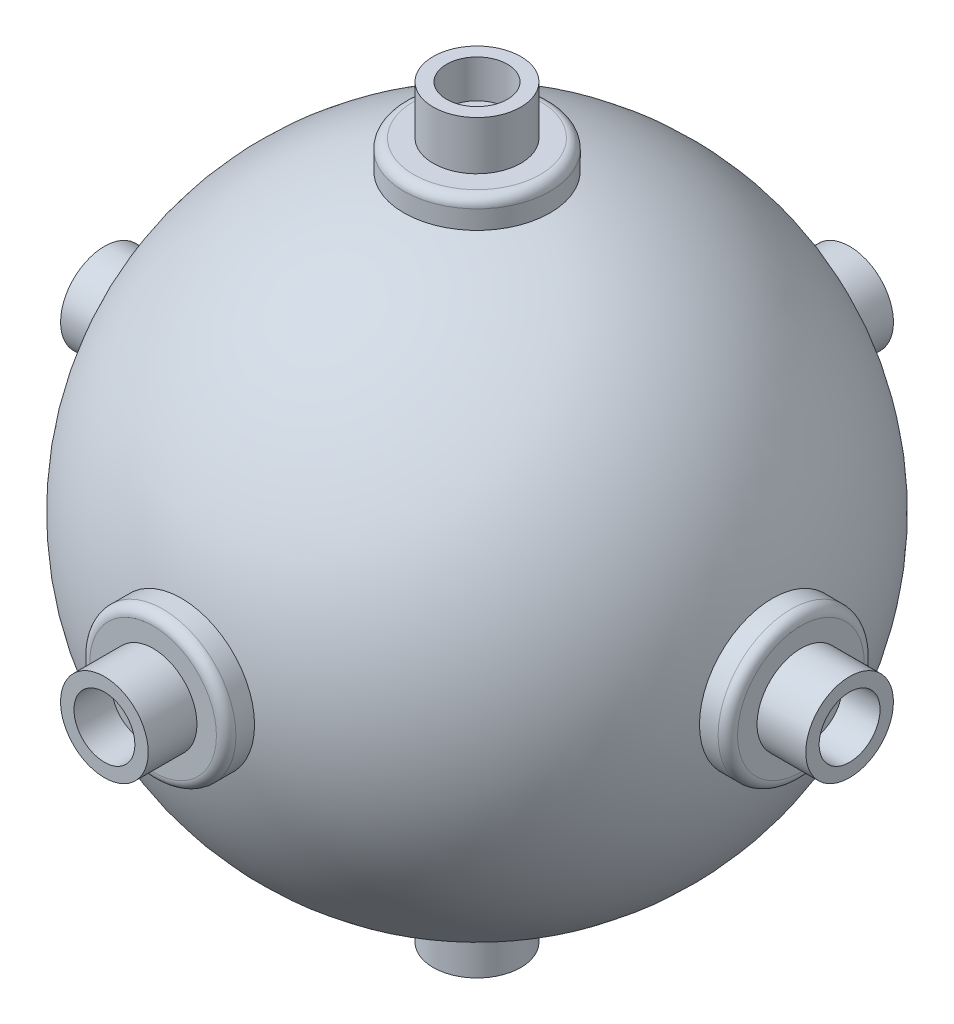
ISO-10303-21;
HEADER;
FILE_DESCRIPTION(('STEP AP214'),'2;1');
FILE_NAME('part.step','',(''),(''),'','','');
FILE_SCHEMA(('AUTOMOTIVE_DESIGN { 1 0 10303 214 1 1 1 1 }'));
ENDSEC;
DATA;
#1=APPLICATION_CONTEXT('core data for automotive mechanical design processes');
#2=APPLICATION_PROTOCOL_DEFINITION('international standard','automotive_design',2000,#1);
#3=PRODUCT_CONTEXT('',#1,'mechanical');
#4=PRODUCT('Part','Part','',(#3));
#5=PRODUCT_RELATED_PRODUCT_CATEGORY('part','',(#4));
#6=PRODUCT_DEFINITION_FORMATION('','',#4);
#7=PRODUCT_DEFINITION_CONTEXT('part definition',#1,'design');
#8=PRODUCT_DEFINITION('design','',#6,#7);
#9=PRODUCT_DEFINITION_SHAPE('','',#8);
#10=(LENGTH_UNIT() NAMED_UNIT(*) SI_UNIT(.MILLI.,.METRE.));
#11=(NAMED_UNIT(*) PLANE_ANGLE_UNIT() SI_UNIT($,.RADIAN.));
#12=(NAMED_UNIT(*) SI_UNIT($,.STERADIAN.) SOLID_ANGLE_UNIT());
#13=UNCERTAINTY_MEASURE_WITH_UNIT(LENGTH_MEASURE(1.E-05),#10,'distance_accuracy_value','');
#14=(GEOMETRIC_REPRESENTATION_CONTEXT(3) GLOBAL_UNCERTAINTY_ASSIGNED_CONTEXT((#13)) GLOBAL_UNIT_ASSIGNED_CONTEXT((#10,
#11,#12)) REPRESENTATION_CONTEXT('',''));
#15=CARTESIAN_POINT('',(0.,0.,0.));
#16=DIRECTION('',(0.,0.,1.));
#17=DIRECTION('',(1.,0.,0.));
#18=AXIS2_PLACEMENT_3D('',#15,#16,#17);
#19=CARTESIAN_POINT('',(0.,0.,0.));
#20=DIRECTION('',(0.,1.,0.));
#21=DIRECTION('',(1.,0.,0.));
#22=AXIS2_PLACEMENT_3D('',#19,#20,#21);
#23=SPHERICAL_SURFACE('',#22,15.875);
#24=CARTESIAN_POINT('',(0.,-15.4110195963797,0.));
#25=DIRECTION('',(0.,1.,0.));
#26=DIRECTION('',(0.,0.,1.));
#27=AXIS2_PLACEMENT_3D('',#24,#25,#26);
#28=CIRCLE('',#27,3.81);
#29=CARTESIAN_POINT('',(0.,-15.4110195963797,3.81));
#30=VERTEX_POINT('',#29);
#31=EDGE_CURVE('E184',#30,#30,#28,.F.);
#32=ORIENTED_EDGE('',*,*,#31,.F.);
#33=EDGE_LOOP('',(#32));
#34=FACE_BOUND('',#33,.T.);
#35=CARTESIAN_POINT('',(15.4110195963797,0.,1.61421861999917E-13));
#36=DIRECTION('',(-1.,0.,0.));
#37=DIRECTION('',(0.,0.,1.));
#38=AXIS2_PLACEMENT_3D('',#35,#36,#37);
#39=CIRCLE('',#38,3.81);
#40=CARTESIAN_POINT('',(15.4110195963797,0.,3.81000000000016));
#41=VERTEX_POINT('',#40);
#42=EDGE_CURVE('E206',#41,#41,#39,.T.);
#43=ORIENTED_EDGE('',*,*,#42,.T.);
#44=EDGE_LOOP('',(#43));
#45=FACE_BOUND('',#44,.T.);
#46=CARTESIAN_POINT('',(-15.4110195963797,0.,0.));
#47=DIRECTION('',(1.,0.,0.));
#48=DIRECTION('',(0.,0.,-1.));
#49=AXIS2_PLACEMENT_3D('',#46,#47,#48);
#50=CIRCLE('',#49,3.81);
#51=CARTESIAN_POINT('',(-15.4110195963797,0.,-3.81000000000005));
#52=VERTEX_POINT('',#51);
#53=EDGE_CURVE('E216',#52,#52,#50,.T.);
#54=ORIENTED_EDGE('',*,*,#53,.T.);
#55=EDGE_LOOP('',(#54));
#56=FACE_BOUND('',#55,.T.);
#57=CARTESIAN_POINT('',(0.,0.,15.4110195963797));
#58=DIRECTION('',(0.,0.,-1.));
#59=DIRECTION('',(-1.,0.,0.));
#60=AXIS2_PLACEMENT_3D('',#57,#58,#59);
#61=CIRCLE('',#60,3.81);
#62=CARTESIAN_POINT('',(-3.81,0.,15.4110195963797));
#63=VERTEX_POINT('',#62);
#64=EDGE_CURVE('E215',#63,#63,#61,.T.);
#65=ORIENTED_EDGE('',*,*,#64,.T.);
#66=EDGE_LOOP('',(#65));
#67=FACE_BOUND('',#66,.T.);
#68=CARTESIAN_POINT('',(0.,0.,-15.4110195963797));
#69=DIRECTION('',(0.,0.,1.));
#70=DIRECTION('',(1.,0.,0.));
#71=AXIS2_PLACEMENT_3D('',#68,#69,#70);
#72=CIRCLE('',#71,3.81);
#73=CARTESIAN_POINT('',(3.81,0.,-15.4110195963797));
#74=VERTEX_POINT('',#73);
#75=EDGE_CURVE('E226',#74,#74,#72,.T.);
#76=ORIENTED_EDGE('',*,*,#75,.T.);
#77=EDGE_LOOP('',(#76));
#78=FACE_BOUND('',#77,.T.);
#79=CARTESIAN_POINT('',(0.,15.4110195963797,0.));
#80=DIRECTION('',(0.,-1.,0.));
#81=DIRECTION('',(0.,0.,-1.));
#82=AXIS2_PLACEMENT_3D('',#79,#80,#81);
#83=CIRCLE('',#82,3.81);
#84=CARTESIAN_POINT('',(0.,15.4110195963797,-3.81));
#85=VERTEX_POINT('',#84);
#86=EDGE_CURVE('E179',#85,#85,#83,.T.);
#87=ORIENTED_EDGE('',*,*,#86,.T.);
#88=EDGE_LOOP('',(#87));
#89=FACE_BOUND('',#88,.T.);
#90=ADVANCED_FACE('F40',(#34,#45,#56,#67,#78,#89),#23,.T.);
#91=CARTESIAN_POINT('',(0.,0.,16.891));
#92=DIRECTION('',(0.,0.,-1.));
#93=DIRECTION('',(-1.,0.,0.));
#94=AXIS2_PLACEMENT_3D('',#91,#92,#93);
#95=CYLINDRICAL_SURFACE('',#94,3.81);
#96=CARTESIAN_POINT('',(0.,0.,16.383));
#97=DIRECTION('',(0.,0.,1.));
#98=DIRECTION('',(1.,0.,0.));
#99=AXIS2_PLACEMENT_3D('',#96,#97,#98);
#100=CIRCLE('',#99,3.81);
#101=CARTESIAN_POINT('',(3.81,0.,16.383));
#102=VERTEX_POINT('',#101);
#103=EDGE_CURVE('E275',#102,#102,#100,.F.);
#104=ORIENTED_EDGE('',*,*,#103,.T.);
#105=EDGE_LOOP('',(#104));
#106=FACE_BOUND('',#105,.T.);
#107=ORIENTED_EDGE('',*,*,#64,.F.);
#108=EDGE_LOOP('',(#107));
#109=FACE_BOUND('',#108,.T.);
#110=ADVANCED_FACE('F295',(#106,#109),#95,.T.);
#111=CARTESIAN_POINT('',(0.,0.,16.891));
#112=DIRECTION('',(0.,0.,1.));
#113=DIRECTION('',(1.,0.,0.));
#114=AXIS2_PLACEMENT_3D('',#111,#112,#113);
#115=PLANE('',#114);
#116=CARTESIAN_POINT('',(0.,0.,16.891));
#117=DIRECTION('',(0.,0.,1.));
#118=DIRECTION('',(1.,0.,0.));
#119=AXIS2_PLACEMENT_3D('',#116,#117,#118);
#120=CIRCLE('',#119,3.302);
#121=CARTESIAN_POINT('',(3.302,0.,16.891));
#122=VERTEX_POINT('',#121);
#123=EDGE_CURVE('E271',#122,#122,#120,.T.);
#124=ORIENTED_EDGE('',*,*,#123,.T.);
#125=EDGE_LOOP('',(#124));
#126=FACE_BOUND('',#125,.T.);
#127=CARTESIAN_POINT('',(0.,0.,16.891));
#128=DIRECTION('',(0.,0.,1.));
#129=DIRECTION('',(1.,0.,0.));
#130=AXIS2_PLACEMENT_3D('',#127,#128,#129);
#131=CIRCLE('',#130,2.286);
#132=CARTESIAN_POINT('',(2.286,0.,16.891));
#133=VERTEX_POINT('',#132);
#134=EDGE_CURVE('E210',#133,#133,#131,.T.);
#135=ORIENTED_EDGE('',*,*,#134,.F.);
#136=EDGE_LOOP('',(#135));
#137=FACE_BOUND('',#136,.T.);
#138=ADVANCED_FACE('F302',(#126,#137),#115,.T.);
#139=CARTESIAN_POINT('',(0.,0.,19.431));
#140=DIRECTION('',(0.,0.,-1.));
#141=DIRECTION('',(-1.,0.,0.));
#142=AXIS2_PLACEMENT_3D('',#139,#140,#141);
#143=CYLINDRICAL_SURFACE('',#142,2.286);
#144=CARTESIAN_POINT('',(0.,0.,19.431));
#145=DIRECTION('',(0.,0.,1.));
#146=DIRECTION('',(1.,0.,0.));
#147=AXIS2_PLACEMENT_3D('',#144,#145,#146);
#148=CIRCLE('',#147,2.286);
#149=CARTESIAN_POINT('',(2.286,0.,19.431));
#150=VERTEX_POINT('',#149);
#151=EDGE_CURVE('E211',#150,#150,#148,.T.);
#152=ORIENTED_EDGE('',*,*,#151,.F.);
#153=EDGE_LOOP('',(#152));
#154=FACE_BOUND('',#153,.T.);
#155=ORIENTED_EDGE('',*,*,#134,.T.);
#156=EDGE_LOOP('',(#155));
#157=FACE_BOUND('',#156,.T.);
#158=ADVANCED_FACE('F389',(#154,#157),#143,.T.);
#159=CARTESIAN_POINT('',(0.,0.,19.431));
#160=DIRECTION('',(0.,0.,1.));
#161=DIRECTION('',(1.,0.,0.));
#162=AXIS2_PLACEMENT_3D('',#159,#160,#161);
#163=PLANE('',#162);
#164=CARTESIAN_POINT('',(0.,2.03528921685183E-13,19.431));
#165=DIRECTION('',(0.,0.,1.));
#166=DIRECTION('',(0.,-1.,0.));
#167=AXIS2_PLACEMENT_3D('',#164,#165,#166);
#168=CIRCLE('',#167,1.5875);
#169=CARTESIAN_POINT('',(0.,-1.5874999999998,19.431));
#170=VERTEX_POINT('',#169);
#171=EDGE_CURVE('E103',#170,#170,#168,.T.);
#172=ORIENTED_EDGE('',*,*,#171,.F.);
#173=EDGE_LOOP('',(#172));
#174=FACE_BOUND('',#173,.T.);
#175=ORIENTED_EDGE('',*,*,#151,.T.);
#176=EDGE_LOOP('',(#175));
#177=FACE_BOUND('',#176,.T.);
#178=ADVANCED_FACE('F385',(#174,#177),#163,.T.);
#179=CARTESIAN_POINT('',(-16.891,0.,0.));
#180=DIRECTION('',(1.,0.,0.));
#181=DIRECTION('',(0.,0.,-1.));
#182=AXIS2_PLACEMENT_3D('',#179,#180,#181);
#183=CYLINDRICAL_SURFACE('',#182,3.81);
#184=CARTESIAN_POINT('',(-16.383,0.,0.));
#185=DIRECTION('',(-1.,0.,0.));
#186=DIRECTION('',(0.,0.,1.));
#187=AXIS2_PLACEMENT_3D('',#184,#185,#186);
#188=CIRCLE('',#187,3.81);
#189=CARTESIAN_POINT('',(-16.383,0.,3.80999999999994));
#190=VERTEX_POINT('',#189);
#191=EDGE_CURVE('E259',#190,#190,#188,.F.);
#192=ORIENTED_EDGE('',*,*,#191,.T.);
#193=EDGE_LOOP('',(#192));
#194=FACE_BOUND('',#193,.T.);
#195=ORIENTED_EDGE('',*,*,#53,.F.);
#196=EDGE_LOOP('',(#195));
#197=FACE_BOUND('',#196,.T.);
#198=ADVANCED_FACE('F381',(#194,#197),#183,.T.);
#199=CARTESIAN_POINT('',(-16.891,0.,0.));
#200=DIRECTION('',(-1.,0.,0.));
#201=DIRECTION('',(0.,0.,1.));
#202=AXIS2_PLACEMENT_3D('',#199,#200,#201);
#203=PLANE('',#202);
#204=CARTESIAN_POINT('',(-16.891,0.,0.));
#205=DIRECTION('',(-1.,0.,0.));
#206=DIRECTION('',(0.,0.,1.));
#207=AXIS2_PLACEMENT_3D('',#204,#205,#206);
#208=CIRCLE('',#207,3.302);
#209=CARTESIAN_POINT('',(-16.891,0.,3.30199999999994));
#210=VERTEX_POINT('',#209);
#211=EDGE_CURVE('E255',#210,#210,#208,.T.);
#212=ORIENTED_EDGE('',*,*,#211,.T.);
#213=EDGE_LOOP('',(#212));
#214=FACE_BOUND('',#213,.T.);
#215=CARTESIAN_POINT('',(-16.891,0.,0.));
#216=DIRECTION('',(-1.,0.,0.));
#217=DIRECTION('',(0.,0.,1.));
#218=AXIS2_PLACEMENT_3D('',#215,#216,#217);
#219=CIRCLE('',#218,2.286);
#220=CARTESIAN_POINT('',(-16.891,0.,2.28599999999994));
#221=VERTEX_POINT('',#220);
#222=EDGE_CURVE('E202',#221,#221,#219,.T.);
#223=ORIENTED_EDGE('',*,*,#222,.F.);
#224=EDGE_LOOP('',(#223));
#225=FACE_BOUND('',#224,.T.);
#226=ADVANCED_FACE('F377',(#214,#225),#203,.T.);
#227=CARTESIAN_POINT('',(0.,0.,-16.891));
#228=DIRECTION('',(0.,0.,1.));
#229=DIRECTION('',(1.,0.,0.));
#230=AXIS2_PLACEMENT_3D('',#227,#228,#229);
#231=CYLINDRICAL_SURFACE('',#230,3.81);
#232=CARTESIAN_POINT('',(0.,0.,-16.383));
#233=DIRECTION('',(0.,0.,-1.));
#234=DIRECTION('',(-1.,0.,0.));
#235=AXIS2_PLACEMENT_3D('',#232,#233,#234);
#236=CIRCLE('',#235,3.81);
#237=CARTESIAN_POINT('',(-3.81,0.,-16.383));
#238=VERTEX_POINT('',#237);
#239=EDGE_CURVE('E243',#238,#238,#236,.F.);
#240=ORIENTED_EDGE('',*,*,#239,.T.);
#241=EDGE_LOOP('',(#240));
#242=FACE_BOUND('',#241,.T.);
#243=ORIENTED_EDGE('',*,*,#75,.F.);
#244=EDGE_LOOP('',(#243));
#245=FACE_BOUND('',#244,.T.);
#246=ADVANCED_FACE('F373',(#242,#245),#231,.T.);
#247=CARTESIAN_POINT('',(0.,0.,-16.891));
#248=DIRECTION('',(0.,0.,-1.));
#249=DIRECTION('',(-1.,0.,0.));
#250=AXIS2_PLACEMENT_3D('',#247,#248,#249);
#251=PLANE('',#250);
#252=CARTESIAN_POINT('',(0.,0.,-16.891));
#253=DIRECTION('',(0.,0.,-1.));
#254=DIRECTION('',(-1.,0.,0.));
#255=AXIS2_PLACEMENT_3D('',#252,#253,#254);
#256=CIRCLE('',#255,3.302);
#257=CARTESIAN_POINT('',(-3.302,0.,-16.891));
#258=VERTEX_POINT('',#257);
#259=EDGE_CURVE('E239',#258,#258,#256,.T.);
#260=ORIENTED_EDGE('',*,*,#259,.T.);
#261=EDGE_LOOP('',(#260));
#262=FACE_BOUND('',#261,.T.);
#263=CARTESIAN_POINT('',(0.,0.,-16.891));
#264=DIRECTION('',(0.,0.,-1.));
#265=DIRECTION('',(-1.,0.,0.));
#266=AXIS2_PLACEMENT_3D('',#263,#264,#265);
#267=CIRCLE('',#266,2.286);
#268=CARTESIAN_POINT('',(-2.286,0.,-16.891));
#269=VERTEX_POINT('',#268);
#270=EDGE_CURVE('E194',#269,#269,#267,.T.);
#271=ORIENTED_EDGE('',*,*,#270,.F.);
#272=EDGE_LOOP('',(#271));
#273=FACE_BOUND('',#272,.T.);
#274=ADVANCED_FACE('F369',(#262,#273),#251,.T.);
#275=CARTESIAN_POINT('',(16.891,0.,1.76923833883198E-13));
#276=DIRECTION('',(-1.,0.,0.));
#277=DIRECTION('',(0.,0.,1.));
#278=AXIS2_PLACEMENT_3D('',#275,#276,#277);
#279=CYLINDRICAL_SURFACE('',#278,3.81);
#280=CARTESIAN_POINT('',(16.383,0.,1.71602816322801E-13));
#281=DIRECTION('',(1.,0.,0.));
#282=DIRECTION('',(0.,0.,-1.));
#283=AXIS2_PLACEMENT_3D('',#280,#281,#282);
#284=CIRCLE('',#283,3.81);
#285=CARTESIAN_POINT('',(16.383,0.,-3.80999999999983));
#286=VERTEX_POINT('',#285);
#287=EDGE_CURVE('E267',#286,#286,#284,.F.);
#288=ORIENTED_EDGE('',*,*,#287,.T.);
#289=EDGE_LOOP('',(#288));
#290=FACE_BOUND('',#289,.T.);
#291=ORIENTED_EDGE('',*,*,#42,.F.);
#292=EDGE_LOOP('',(#291));
#293=FACE_BOUND('',#292,.T.);
#294=ADVANCED_FACE('F334',(#290,#293),#279,.T.);
#295=CARTESIAN_POINT('',(16.891,0.,1.76923833883198E-13));
#296=DIRECTION('',(1.,0.,0.));
#297=DIRECTION('',(0.,0.,-1.));
#298=AXIS2_PLACEMENT_3D('',#295,#296,#297);
#299=PLANE('',#298);
#300=CARTESIAN_POINT('',(16.891,0.,1.76923833883198E-13));
#301=DIRECTION('',(1.,0.,0.));
#302=DIRECTION('',(0.,0.,-1.));
#303=AXIS2_PLACEMENT_3D('',#300,#301,#302);
#304=CIRCLE('',#303,3.302);
#305=CARTESIAN_POINT('',(16.891,0.,-3.30199999999982));
#306=VERTEX_POINT('',#305);
#307=EDGE_CURVE('E263',#306,#306,#304,.T.);
#308=ORIENTED_EDGE('',*,*,#307,.T.);
#309=EDGE_LOOP('',(#308));
#310=FACE_BOUND('',#309,.T.);
#311=CARTESIAN_POINT('',(16.891,0.,1.76923833883198E-13));
#312=DIRECTION('',(1.,0.,0.));
#313=DIRECTION('',(0.,0.,-1.));
#314=AXIS2_PLACEMENT_3D('',#311,#312,#313);
#315=CIRCLE('',#314,2.286);
#316=CARTESIAN_POINT('',(16.891,0.,-2.28599999999982));
#317=VERTEX_POINT('',#316);
#318=EDGE_CURVE('E185',#317,#317,#315,.T.);
#319=ORIENTED_EDGE('',*,*,#318,.F.);
#320=EDGE_LOOP('',(#319));
#321=FACE_BOUND('',#320,.T.);
#322=ADVANCED_FACE('F330',(#310,#321),#299,.T.);
#323=CARTESIAN_POINT('',(-19.431,0.,0.));
#324=DIRECTION('',(1.,0.,0.));
#325=DIRECTION('',(0.,0.,-1.));
#326=AXIS2_PLACEMENT_3D('',#323,#324,#325);
#327=CYLINDRICAL_SURFACE('',#326,2.286);
#328=CARTESIAN_POINT('',(-19.431,0.,0.));
#329=DIRECTION('',(-1.,0.,0.));
#330=DIRECTION('',(0.,0.,1.));
#331=AXIS2_PLACEMENT_3D('',#328,#329,#330);
#332=CIRCLE('',#331,2.286);
#333=CARTESIAN_POINT('',(-19.431,0.,2.28599999999993));
#334=VERTEX_POINT('',#333);
#335=EDGE_CURVE('E198',#334,#334,#332,.T.);
#336=ORIENTED_EDGE('',*,*,#335,.F.);
#337=EDGE_LOOP('',(#336));
#338=FACE_BOUND('',#337,.T.);
#339=ORIENTED_EDGE('',*,*,#222,.T.);
#340=EDGE_LOOP('',(#339));
#341=FACE_BOUND('',#340,.T.);
#342=ADVANCED_FACE('F333',(#338,#341),#327,.T.);
#343=CARTESIAN_POINT('',(-19.431,0.,0.));
#344=DIRECTION('',(-1.,0.,0.));
#345=DIRECTION('',(0.,0.,1.));
#346=AXIS2_PLACEMENT_3D('',#343,#344,#345);
#347=PLANE('',#346);
#348=CARTESIAN_POINT('',(-19.431,0.,2.03528921685183E-13));
#349=DIRECTION('',(-1.,0.,0.));
#350=DIRECTION('',(0.,0.,1.));
#351=AXIS2_PLACEMENT_3D('',#348,#349,#350);
#352=CIRCLE('',#351,1.5875);
#353=CARTESIAN_POINT('',(-19.431,0.,1.5875000000002));
#354=VERTEX_POINT('',#353);
#355=EDGE_CURVE('E898',#354,#354,#352,.T.);
#356=ORIENTED_EDGE('',*,*,#355,.F.);
#357=EDGE_LOOP('',(#356));
#358=FACE_BOUND('',#357,.T.);
#359=ORIENTED_EDGE('',*,*,#335,.T.);
#360=EDGE_LOOP('',(#359));
#361=FACE_BOUND('',#360,.T.);
#362=ADVANCED_FACE('F359',(#358,#361),#347,.T.);
#363=CARTESIAN_POINT('',(0.,0.,-19.431));
#364=DIRECTION('',(0.,0.,1.));
#365=DIRECTION('',(1.,0.,0.));
#366=AXIS2_PLACEMENT_3D('',#363,#364,#365);
#367=CYLINDRICAL_SURFACE('',#366,2.286);
#368=CARTESIAN_POINT('',(0.,0.,-19.431));
#369=DIRECTION('',(0.,0.,-1.));
#370=DIRECTION('',(-1.,0.,0.));
#371=AXIS2_PLACEMENT_3D('',#368,#369,#370);
#372=CIRCLE('',#371,2.286);
#373=CARTESIAN_POINT('',(-2.286,0.,-19.431));
#374=VERTEX_POINT('',#373);
#375=EDGE_CURVE('E190',#374,#374,#372,.T.);
#376=ORIENTED_EDGE('',*,*,#375,.F.);
#377=EDGE_LOOP('',(#376));
#378=FACE_BOUND('',#377,.T.);
#379=ORIENTED_EDGE('',*,*,#270,.T.);
#380=EDGE_LOOP('',(#379));
#381=FACE_BOUND('',#380,.T.);
#382=ADVANCED_FACE('F351',(#378,#381),#367,.T.);
#383=CARTESIAN_POINT('',(0.,0.,-19.431));
#384=DIRECTION('',(0.,0.,-1.));
#385=DIRECTION('',(-1.,0.,0.));
#386=AXIS2_PLACEMENT_3D('',#383,#384,#385);
#387=PLANE('',#386);
#388=CARTESIAN_POINT('',(0.,0.,-19.431));
#389=DIRECTION('',(0.,0.,-1.));
#390=DIRECTION('',(0.,1.,0.));
#391=AXIS2_PLACEMENT_3D('',#388,#389,#390);
#392=CIRCLE('',#391,1.5875);
#393=CARTESIAN_POINT('',(0.,1.58749999999993,-19.431));
#394=VERTEX_POINT('',#393);
#395=EDGE_CURVE('E135',#394,#394,#392,.T.);
#396=ORIENTED_EDGE('',*,*,#395,.F.);
#397=EDGE_LOOP('',(#396));
#398=FACE_BOUND('',#397,.T.);
#399=ORIENTED_EDGE('',*,*,#375,.T.);
#400=EDGE_LOOP('',(#399));
#401=FACE_BOUND('',#400,.T.);
#402=ADVANCED_FACE('F341',(#398,#401),#387,.T.);
#403=CARTESIAN_POINT('',(19.431,0.,2.03528921685183E-13));
#404=DIRECTION('',(-1.,0.,0.));
#405=DIRECTION('',(0.,0.,1.));
#406=AXIS2_PLACEMENT_3D('',#403,#404,#405);
#407=CYLINDRICAL_SURFACE('',#406,2.286);
#408=CARTESIAN_POINT('',(19.431,0.,2.03528921685183E-13));
#409=DIRECTION('',(1.,0.,0.));
#410=DIRECTION('',(0.,0.,-1.));
#411=AXIS2_PLACEMENT_3D('',#408,#409,#410);
#412=CIRCLE('',#411,2.286);
#413=CARTESIAN_POINT('',(19.431,0.,-2.2859999999998));
#414=VERTEX_POINT('',#413);
#415=EDGE_CURVE('E186',#414,#414,#412,.T.);
#416=ORIENTED_EDGE('',*,*,#415,.F.);
#417=EDGE_LOOP('',(#416));
#418=FACE_BOUND('',#417,.T.);
#419=ORIENTED_EDGE('',*,*,#318,.T.);
#420=EDGE_LOOP('',(#419));
#421=FACE_BOUND('',#420,.T.);
#422=ADVANCED_FACE('F338',(#418,#421),#407,.T.);
#423=CARTESIAN_POINT('',(19.431,0.,2.03528921685183E-13));
#424=DIRECTION('',(1.,0.,0.));
#425=DIRECTION('',(0.,0.,-1.));
#426=AXIS2_PLACEMENT_3D('',#423,#424,#425);
#427=PLANE('',#426);
#428=CARTESIAN_POINT('',(19.431,0.,2.03528921685183E-13));
#429=DIRECTION('',(1.,0.,0.));
#430=DIRECTION('',(0.,0.,-1.));
#431=AXIS2_PLACEMENT_3D('',#428,#429,#430);
#432=CIRCLE('',#431,1.5875);
#433=CARTESIAN_POINT('',(19.431,0.,-1.58749999999979));
#434=VERTEX_POINT('',#433);
#435=EDGE_CURVE('E79',#434,#434,#432,.T.);
#436=ORIENTED_EDGE('',*,*,#435,.F.);
#437=EDGE_LOOP('',(#436));
#438=FACE_BOUND('',#437,.T.);
#439=ORIENTED_EDGE('',*,*,#415,.T.);
#440=EDGE_LOOP('',(#439));
#441=FACE_BOUND('',#440,.T.);
#442=ADVANCED_FACE('F340',(#438,#441),#427,.T.);
#443=CARTESIAN_POINT('',(0.,16.891,0.));
#444=DIRECTION('',(0.,-1.,0.));
#445=DIRECTION('',(0.,0.,-1.));
#446=AXIS2_PLACEMENT_3D('',#443,#444,#445);
#447=CYLINDRICAL_SURFACE('',#446,3.81);
#448=CARTESIAN_POINT('',(0.,16.383,0.));
#449=DIRECTION('',(0.,1.,0.));
#450=DIRECTION('',(0.,0.,1.));
#451=AXIS2_PLACEMENT_3D('',#448,#449,#450);
#452=CIRCLE('',#451,3.81);
#453=CARTESIAN_POINT('',(0.,16.383,3.81));
#454=VERTEX_POINT('',#453);
#455=EDGE_CURVE('E11',#454,#454,#452,.F.);
#456=ORIENTED_EDGE('',*,*,#455,.T.);
#457=EDGE_LOOP('',(#456));
#458=FACE_BOUND('',#457,.T.);
#459=ORIENTED_EDGE('',*,*,#86,.F.);
#460=EDGE_LOOP('',(#459));
#461=FACE_BOUND('',#460,.T.);
#462=ADVANCED_FACE('F348',(#458,#461),#447,.T.);
#463=CARTESIAN_POINT('',(0.,16.891,0.));
#464=DIRECTION('',(0.,1.,0.));
#465=DIRECTION('',(0.,0.,1.));
#466=AXIS2_PLACEMENT_3D('',#463,#464,#465);
#467=PLANE('',#466);
#468=CARTESIAN_POINT('',(0.,16.891,0.));
#469=DIRECTION('',(0.,1.,0.));
#470=DIRECTION('',(0.,0.,1.));
#471=AXIS2_PLACEMENT_3D('',#468,#469,#470);
#472=CIRCLE('',#471,3.302);
#473=CARTESIAN_POINT('',(0.,16.891,3.302));
#474=VERTEX_POINT('',#473);
#475=EDGE_CURVE('E49',#474,#474,#472,.T.);
#476=ORIENTED_EDGE('',*,*,#475,.T.);
#477=EDGE_LOOP('',(#476));
#478=FACE_BOUND('',#477,.T.);
#479=CARTESIAN_POINT('',(0.,16.891,0.));
#480=DIRECTION('',(0.,1.,0.));
#481=DIRECTION('',(0.,0.,1.));
#482=AXIS2_PLACEMENT_3D('',#479,#480,#481);
#483=CIRCLE('',#482,2.286);
#484=CARTESIAN_POINT('',(0.,16.891,2.286));
#485=VERTEX_POINT('',#484);
#486=EDGE_CURVE('E180',#485,#485,#483,.T.);
#487=ORIENTED_EDGE('',*,*,#486,.F.);
#488=EDGE_LOOP('',(#487));
#489=FACE_BOUND('',#488,.T.);
#490=ADVANCED_FACE('F282',(#478,#489),#467,.T.);
#491=CARTESIAN_POINT('',(0.,19.431,0.));
#492=DIRECTION('',(0.,-1.,0.));
#493=DIRECTION('',(0.,0.,-1.));
#494=AXIS2_PLACEMENT_3D('',#491,#492,#493);
#495=CYLINDRICAL_SURFACE('',#494,2.286);
#496=CARTESIAN_POINT('',(0.,19.431,0.));
#497=DIRECTION('',(0.,1.,0.));
#498=DIRECTION('',(0.,0.,1.));
#499=AXIS2_PLACEMENT_3D('',#496,#497,#498);
#500=CIRCLE('',#499,2.286);
#501=CARTESIAN_POINT('',(0.,19.431,2.286));
#502=VERTEX_POINT('',#501);
#503=EDGE_CURVE('E172',#502,#502,#500,.T.);
#504=ORIENTED_EDGE('',*,*,#503,.F.);
#505=EDGE_LOOP('',(#504));
#506=FACE_BOUND('',#505,.T.);
#507=ORIENTED_EDGE('',*,*,#486,.T.);
#508=EDGE_LOOP('',(#507));
#509=FACE_BOUND('',#508,.T.);
#510=ADVANCED_FACE('F440',(#506,#509),#495,.T.);
#511=CARTESIAN_POINT('',(0.,19.431,0.));
#512=DIRECTION('',(0.,1.,0.));
#513=DIRECTION('',(0.,0.,1.));
#514=AXIS2_PLACEMENT_3D('',#511,#512,#513);
#515=PLANE('',#514);
#516=CARTESIAN_POINT('',(0.,19.431,0.));
#517=DIRECTION('',(0.,1.,0.));
#518=DIRECTION('',(0.,0.,1.));
#519=AXIS2_PLACEMENT_3D('',#516,#517,#518);
#520=CIRCLE('',#519,1.5875);
#521=CARTESIAN_POINT('',(0.,19.431,1.5875));
#522=VERTEX_POINT('',#521);
#523=EDGE_CURVE('E151',#522,#522,#520,.T.);
#524=ORIENTED_EDGE('',*,*,#523,.F.);
#525=EDGE_LOOP('',(#524));
#526=FACE_BOUND('',#525,.T.);
#527=ORIENTED_EDGE('',*,*,#503,.T.);
#528=EDGE_LOOP('',(#527));
#529=FACE_BOUND('',#528,.T.);
#530=ADVANCED_FACE('F450',(#526,#529),#515,.T.);
#531=CARTESIAN_POINT('',(0.,-16.891,0.));
#532=DIRECTION('',(0.,1.,0.));
#533=DIRECTION('',(0.,0.,1.));
#534=AXIS2_PLACEMENT_3D('',#531,#532,#533);
#535=CYLINDRICAL_SURFACE('',#534,3.81);
#536=CARTESIAN_POINT('',(0.,-16.383,0.));
#537=DIRECTION('',(0.,-1.,0.));
#538=DIRECTION('',(0.,0.,-1.));
#539=AXIS2_PLACEMENT_3D('',#536,#537,#538);
#540=CIRCLE('',#539,3.81);
#541=CARTESIAN_POINT('',(0.,-16.383,-3.81));
#542=VERTEX_POINT('',#541);
#543=EDGE_CURVE('E247',#542,#542,#540,.F.);
#544=ORIENTED_EDGE('',*,*,#543,.T.);
#545=EDGE_LOOP('',(#544));
#546=FACE_BOUND('',#545,.T.);
#547=ORIENTED_EDGE('',*,*,#31,.T.);
#548=EDGE_LOOP('',(#547));
#549=FACE_BOUND('',#548,.T.);
#550=ADVANCED_FACE('F445',(#546,#549),#535,.T.);
#551=CARTESIAN_POINT('',(0.,-16.891,0.));
#552=DIRECTION('',(0.,-1.,0.));
#553=DIRECTION('',(0.,0.,1.));
#554=AXIS2_PLACEMENT_3D('',#551,#552,#553);
#555=PLANE('',#554);
#556=CARTESIAN_POINT('',(0.,-16.891,0.));
#557=DIRECTION('',(0.,-1.,0.));
#558=DIRECTION('',(0.,0.,-1.));
#559=AXIS2_PLACEMENT_3D('',#556,#557,#558);
#560=CIRCLE('',#559,3.302);
#561=CARTESIAN_POINT('',(0.,-16.891,-3.302));
#562=VERTEX_POINT('',#561);
#563=EDGE_CURVE('E251',#562,#562,#560,.T.);
#564=ORIENTED_EDGE('',*,*,#563,.T.);
#565=EDGE_LOOP('',(#564));
#566=FACE_BOUND('',#565,.T.);
#567=CARTESIAN_POINT('',(0.,-16.891,0.));
#568=DIRECTION('',(0.,1.,0.));
#569=DIRECTION('',(0.,0.,1.));
#570=AXIS2_PLACEMENT_3D('',#567,#568,#569);
#571=CIRCLE('',#570,2.286);
#572=CARTESIAN_POINT('',(0.,-16.891,2.286));
#573=VERTEX_POINT('',#572);
#574=EDGE_CURVE('E167',#573,#573,#571,.T.);
#575=ORIENTED_EDGE('',*,*,#574,.T.);
#576=EDGE_LOOP('',(#575));
#577=FACE_BOUND('',#576,.T.);
#578=ADVANCED_FACE('F449',(#566,#577),#555,.T.);
#579=CARTESIAN_POINT('',(0.,-19.431,0.));
#580=DIRECTION('',(0.,1.,0.));
#581=DIRECTION('',(0.,0.,1.));
#582=AXIS2_PLACEMENT_3D('',#579,#580,#581);
#583=CYLINDRICAL_SURFACE('',#582,2.286);
#584=CARTESIAN_POINT('',(0.,-19.431,0.));
#585=DIRECTION('',(0.,1.,0.));
#586=DIRECTION('',(0.,0.,1.));
#587=AXIS2_PLACEMENT_3D('',#584,#585,#586);
#588=CIRCLE('',#587,2.286);
#589=CARTESIAN_POINT('',(0.,-19.431,2.286));
#590=VERTEX_POINT('',#589);
#591=EDGE_CURVE('E168',#590,#590,#588,.T.);
#592=ORIENTED_EDGE('',*,*,#591,.T.);
#593=EDGE_LOOP('',(#592));
#594=FACE_BOUND('',#593,.T.);
#595=ORIENTED_EDGE('',*,*,#574,.F.);
#596=EDGE_LOOP('',(#595));
#597=FACE_BOUND('',#596,.T.);
#598=ADVANCED_FACE('F459',(#594,#597),#583,.T.);
#599=CARTESIAN_POINT('',(0.,-19.431,0.));
#600=DIRECTION('',(0.,-1.,0.));
#601=DIRECTION('',(0.,0.,1.));
#602=AXIS2_PLACEMENT_3D('',#599,#600,#601);
#603=PLANE('',#602);
#604=CARTESIAN_POINT('',(0.,-19.431,0.));
#605=DIRECTION('',(0.,-1.,0.));
#606=DIRECTION('',(0.,0.,-1.));
#607=AXIS2_PLACEMENT_3D('',#604,#605,#606);
#608=CIRCLE('',#607,1.5875);
#609=CARTESIAN_POINT('',(0.,-19.431,-1.5875));
#610=VERTEX_POINT('',#609);
#611=EDGE_CURVE('E119',#610,#610,#608,.T.);
#612=ORIENTED_EDGE('',*,*,#611,.F.);
#613=EDGE_LOOP('',(#612));
#614=FACE_BOUND('',#613,.T.);
#615=ORIENTED_EDGE('',*,*,#591,.F.);
#616=EDGE_LOOP('',(#615));
#617=FACE_BOUND('',#616,.T.);
#618=ADVANCED_FACE('F679',(#614,#617),#603,.T.);
#619=CARTESIAN_POINT('',(0.,15.621,0.));
#620=DIRECTION('',(0.,1.,0.));
#621=DIRECTION('',(0.,0.,1.));
#622=AXIS2_PLACEMENT_3D('',#619,#620,#621);
#623=CONICAL_SURFACE('',#622,0.698499999999999,1.02974425867665);
#624=CARTESIAN_POINT('',(0.,15.2012988576092,0.));
#625=VERTEX_POINT('',#624);
#626=VERTEX_LOOP('',#625);
#627=FACE_BOUND('',#626,.T.);
#628=CARTESIAN_POINT('',(0.,15.621,0.));
#629=DIRECTION('',(0.,1.,0.));
#630=DIRECTION('',(0.,0.,1.));
#631=AXIS2_PLACEMENT_3D('',#628,#629,#630);
#632=CIRCLE('',#631,0.698499999999999);
#633=CARTESIAN_POINT('',(0.,15.621,0.698499999999999));
#634=VERTEX_POINT('',#633);
#635=EDGE_CURVE('E163',#634,#634,#632,.T.);
#636=ORIENTED_EDGE('',*,*,#635,.T.);
#637=EDGE_LOOP('',(#636));
#638=FACE_BOUND('',#637,.T.);
#639=ADVANCED_FACE('F671',(#627,#638),#623,.F.);
#640=CARTESIAN_POINT('',(0.,19.431,0.));
#641=DIRECTION('',(0.,1.,0.));
#642=DIRECTION('',(0.,0.,1.));
#643=AXIS2_PLACEMENT_3D('',#640,#641,#642);
#644=CYLINDRICAL_SURFACE('',#643,0.698499999999999);
#645=ORIENTED_EDGE('',*,*,#635,.F.);
#646=EDGE_LOOP('',(#645));
#647=FACE_BOUND('',#646,.T.);
#648=CARTESIAN_POINT('',(0.,17.4498,0.));
#649=DIRECTION('',(0.,1.,0.));
#650=DIRECTION('',(0.,0.,1.));
#651=AXIS2_PLACEMENT_3D('',#648,#649,#650);
#652=CIRCLE('',#651,0.698499999999999);
#653=CARTESIAN_POINT('',(0.,17.4498,0.698499999999999));
#654=VERTEX_POINT('',#653);
#655=EDGE_CURVE('E159',#654,#654,#652,.T.);
#656=ORIENTED_EDGE('',*,*,#655,.T.);
#657=EDGE_LOOP('',(#656));
#658=FACE_BOUND('',#657,.T.);
#659=ADVANCED_FACE('F663',(#647,#658),#644,.F.);
#660=CARTESIAN_POINT('',(0.698499999999999,17.4498,0.));
#661=DIRECTION('',(0.,-1.,0.));
#662=DIRECTION('',(0.,0.,-1.));
#663=AXIS2_PLACEMENT_3D('',#660,#661,#662);
#664=PLANE('',#663);
#665=ORIENTED_EDGE('',*,*,#655,.F.);
#666=EDGE_LOOP('',(#665));
#667=FACE_BOUND('',#666,.T.);
#668=CARTESIAN_POINT('',(0.,17.4498,0.));
#669=DIRECTION('',(0.,1.,0.));
#670=DIRECTION('',(0.,0.,1.));
#671=AXIS2_PLACEMENT_3D('',#668,#669,#670);
#672=CIRCLE('',#671,1.5875);
#673=CARTESIAN_POINT('',(0.,17.4498,1.5875));
#674=VERTEX_POINT('',#673);
#675=EDGE_CURVE('E155',#674,#674,#672,.T.);
#676=ORIENTED_EDGE('',*,*,#675,.T.);
#677=EDGE_LOOP('',(#676));
#678=FACE_BOUND('',#677,.T.);
#679=ADVANCED_FACE('F654',(#667,#678),#664,.F.);
#680=CARTESIAN_POINT('',(0.,19.431,0.));
#681=DIRECTION('',(0.,1.,0.));
#682=DIRECTION('',(0.,0.,1.));
#683=AXIS2_PLACEMENT_3D('',#680,#681,#682);
#684=CYLINDRICAL_SURFACE('',#683,1.5875);
#685=ORIENTED_EDGE('',*,*,#675,.F.);
#686=EDGE_LOOP('',(#685));
#687=FACE_BOUND('',#686,.T.);
#688=ORIENTED_EDGE('',*,*,#523,.T.);
#689=EDGE_LOOP('',(#688));
#690=FACE_BOUND('',#689,.T.);
#691=ADVANCED_FACE('F646',(#687,#690),#684,.F.);
#692=CARTESIAN_POINT('',(0.,0.,-15.621));
#693=DIRECTION('',(0.,0.,-1.));
#694=DIRECTION('',(0.,1.,0.));
#695=AXIS2_PLACEMENT_3D('',#692,#693,#694);
#696=CONICAL_SURFACE('',#695,0.698499999999999,1.02974425867665);
#697=CARTESIAN_POINT('',(0.,0.,-15.2012988576092));
#698=VERTEX_POINT('',#697);
#699=VERTEX_LOOP('',#698);
#700=FACE_BOUND('',#699,.T.);
#701=CARTESIAN_POINT('',(0.,0.,-15.621));
#702=DIRECTION('',(0.,0.,-1.));
#703=DIRECTION('',(0.,1.,0.));
#704=AXIS2_PLACEMENT_3D('',#701,#702,#703);
#705=CIRCLE('',#704,0.698499999999999);
#706=CARTESIAN_POINT('',(0.,0.698499999999944,-15.621));
#707=VERTEX_POINT('',#706);
#708=EDGE_CURVE('E147',#707,#707,#705,.T.);
#709=ORIENTED_EDGE('',*,*,#708,.T.);
#710=EDGE_LOOP('',(#709));
#711=FACE_BOUND('',#710,.T.);
#712=ADVANCED_FACE('F638',(#700,#711),#696,.F.);
#713=CARTESIAN_POINT('',(0.,0.,-19.431));
#714=DIRECTION('',(0.,0.,-1.));
#715=DIRECTION('',(0.,1.,0.));
#716=AXIS2_PLACEMENT_3D('',#713,#714,#715);
#717=CYLINDRICAL_SURFACE('',#716,0.698499999999999);
#718=ORIENTED_EDGE('',*,*,#708,.F.);
#719=EDGE_LOOP('',(#718));
#720=FACE_BOUND('',#719,.T.);
#721=CARTESIAN_POINT('',(0.,0.,-17.4498));
#722=DIRECTION('',(0.,0.,-1.));
#723=DIRECTION('',(0.,1.,0.));
#724=AXIS2_PLACEMENT_3D('',#721,#722,#723);
#725=CIRCLE('',#724,0.698499999999999);
#726=CARTESIAN_POINT('',(0.,0.698499999999938,-17.4498));
#727=VERTEX_POINT('',#726);
#728=EDGE_CURVE('E143',#727,#727,#725,.T.);
#729=ORIENTED_EDGE('',*,*,#728,.T.);
#730=EDGE_LOOP('',(#729));
#731=FACE_BOUND('',#730,.T.);
#732=ADVANCED_FACE('F630',(#720,#731),#717,.F.);
#733=CARTESIAN_POINT('',(0.698499999999999,0.,-17.4498));
#734=DIRECTION('',(0.,0.,1.));
#735=DIRECTION('',(0.,-1.,0.));
#736=AXIS2_PLACEMENT_3D('',#733,#734,#735);
#737=PLANE('',#736);
#738=ORIENTED_EDGE('',*,*,#728,.F.);
#739=EDGE_LOOP('',(#738));
#740=FACE_BOUND('',#739,.T.);
#741=CARTESIAN_POINT('',(0.,0.,-17.4498));
#742=DIRECTION('',(0.,0.,-1.));
#743=DIRECTION('',(0.,1.,0.));
#744=AXIS2_PLACEMENT_3D('',#741,#742,#743);
#745=CIRCLE('',#744,1.5875);
#746=CARTESIAN_POINT('',(0.,1.58749999999994,-17.4498));
#747=VERTEX_POINT('',#746);
#748=EDGE_CURVE('E139',#747,#747,#745,.T.);
#749=ORIENTED_EDGE('',*,*,#748,.T.);
#750=EDGE_LOOP('',(#749));
#751=FACE_BOUND('',#750,.T.);
#752=ADVANCED_FACE('F622',(#740,#751),#737,.F.);
#753=CARTESIAN_POINT('',(0.,0.,-19.431));
#754=DIRECTION('',(0.,0.,-1.));
#755=DIRECTION('',(0.,1.,0.));
#756=AXIS2_PLACEMENT_3D('',#753,#754,#755);
#757=CYLINDRICAL_SURFACE('',#756,1.5875);
#758=ORIENTED_EDGE('',*,*,#748,.F.);
#759=EDGE_LOOP('',(#758));
#760=FACE_BOUND('',#759,.T.);
#761=ORIENTED_EDGE('',*,*,#395,.T.);
#762=EDGE_LOOP('',(#761));
#763=FACE_BOUND('',#762,.T.);
#764=ADVANCED_FACE('F614',(#760,#763),#757,.F.);
#765=CARTESIAN_POINT('',(0.,-15.621,0.));
#766=DIRECTION('',(0.,-1.,0.));
#767=DIRECTION('',(0.,0.,-1.));
#768=AXIS2_PLACEMENT_3D('',#765,#766,#767);
#769=CONICAL_SURFACE('',#768,0.698499999999999,1.02974425867665);
#770=CARTESIAN_POINT('',(0.,-15.2012988576092,0.));
#771=VERTEX_POINT('',#770);
#772=VERTEX_LOOP('',#771);
#773=FACE_BOUND('',#772,.T.);
#774=CARTESIAN_POINT('',(0.,-15.621,0.));
#775=DIRECTION('',(0.,-1.,0.));
#776=DIRECTION('',(0.,0.,-1.));
#777=AXIS2_PLACEMENT_3D('',#774,#775,#776);
#778=CIRCLE('',#777,0.698499999999999);
#779=CARTESIAN_POINT('',(0.,-15.621,-0.698499999999999));
#780=VERTEX_POINT('',#779);
#781=EDGE_CURVE('E131',#780,#780,#778,.T.);
#782=ORIENTED_EDGE('',*,*,#781,.T.);
#783=EDGE_LOOP('',(#782));
#784=FACE_BOUND('',#783,.T.);
#785=ADVANCED_FACE('F606',(#773,#784),#769,.F.);
#786=CARTESIAN_POINT('',(0.,-19.431,0.));
#787=DIRECTION('',(0.,-1.,0.));
#788=DIRECTION('',(0.,0.,-1.));
#789=AXIS2_PLACEMENT_3D('',#786,#787,#788);
#790=CYLINDRICAL_SURFACE('',#789,0.698499999999999);
#791=ORIENTED_EDGE('',*,*,#781,.F.);
#792=EDGE_LOOP('',(#791));
#793=FACE_BOUND('',#792,.T.);
#794=CARTESIAN_POINT('',(0.,-17.4498,0.));
#795=DIRECTION('',(0.,-1.,0.));
#796=DIRECTION('',(0.,0.,-1.));
#797=AXIS2_PLACEMENT_3D('',#794,#795,#796);
#798=CIRCLE('',#797,0.698499999999999);
#799=CARTESIAN_POINT('',(0.,-17.4498,-0.698499999999999));
#800=VERTEX_POINT('',#799);
#801=EDGE_CURVE('E127',#800,#800,#798,.T.);
#802=ORIENTED_EDGE('',*,*,#801,.T.);
#803=EDGE_LOOP('',(#802));
#804=FACE_BOUND('',#803,.T.);
#805=ADVANCED_FACE('F598',(#793,#804),#790,.F.);
#806=CARTESIAN_POINT('',(0.698499999999999,-17.4498,0.));
#807=DIRECTION('',(0.,1.,0.));
#808=DIRECTION('',(0.,0.,1.));
#809=AXIS2_PLACEMENT_3D('',#806,#807,#808);
#810=PLANE('',#809);
#811=ORIENTED_EDGE('',*,*,#801,.F.);
#812=EDGE_LOOP('',(#811));
#813=FACE_BOUND('',#812,.T.);
#814=CARTESIAN_POINT('',(0.,-17.4498,0.));
#815=DIRECTION('',(0.,-1.,0.));
#816=DIRECTION('',(0.,0.,-1.));
#817=AXIS2_PLACEMENT_3D('',#814,#815,#816);
#818=CIRCLE('',#817,1.5875);
#819=CARTESIAN_POINT('',(0.,-17.4498,-1.5875));
#820=VERTEX_POINT('',#819);
#821=EDGE_CURVE('E123',#820,#820,#818,.T.);
#822=ORIENTED_EDGE('',*,*,#821,.T.);
#823=EDGE_LOOP('',(#822));
#824=FACE_BOUND('',#823,.T.);
#825=ADVANCED_FACE('F590',(#813,#824),#810,.F.);
#826=CARTESIAN_POINT('',(0.,-19.431,0.));
#827=DIRECTION('',(0.,-1.,0.));
#828=DIRECTION('',(0.,0.,-1.));
#829=AXIS2_PLACEMENT_3D('',#826,#827,#828);
#830=CYLINDRICAL_SURFACE('',#829,1.5875);
#831=ORIENTED_EDGE('',*,*,#821,.F.);
#832=EDGE_LOOP('',(#831));
#833=FACE_BOUND('',#832,.T.);
#834=ORIENTED_EDGE('',*,*,#611,.T.);
#835=EDGE_LOOP('',(#834));
#836=FACE_BOUND('',#835,.T.);
#837=ADVANCED_FACE('F582',(#833,#836),#830,.F.);
#838=CARTESIAN_POINT('',(0.,1.63621289982206E-13,15.621));
#839=DIRECTION('',(0.,0.,1.));
#840=DIRECTION('',(0.,-1.,0.));
#841=AXIS2_PLACEMENT_3D('',#838,#839,#840);
#842=CONICAL_SURFACE('',#841,0.698499999999999,1.02974425867665);
#843=CARTESIAN_POINT('',(0.,1.5922515386256E-13,15.2012988576092));
#844=VERTEX_POINT('',#843);
#845=VERTEX_LOOP('',#844);
#846=FACE_BOUND('',#845,.T.);
#847=CARTESIAN_POINT('',(0.,1.63621289982206E-13,15.621));
#848=DIRECTION('',(0.,0.,1.));
#849=DIRECTION('',(0.,-1.,0.));
#850=AXIS2_PLACEMENT_3D('',#847,#848,#849);
#851=CIRCLE('',#850,0.698499999999999);
#852=CARTESIAN_POINT('',(0.,-0.698499999999835,15.621));
#853=VERTEX_POINT('',#852);
#854=EDGE_CURVE('E115',#853,#853,#851,.T.);
#855=ORIENTED_EDGE('',*,*,#854,.T.);
#856=EDGE_LOOP('',(#855));
#857=FACE_BOUND('',#856,.T.);
#858=ADVANCED_FACE('F574',(#846,#857),#842,.F.);
#859=CARTESIAN_POINT('',(0.,2.03528921685183E-13,19.431));
#860=DIRECTION('',(0.,0.,1.));
#861=DIRECTION('',(0.,-1.,0.));
#862=AXIS2_PLACEMENT_3D('',#859,#860,#861);
#863=CYLINDRICAL_SURFACE('',#862,0.698499999999999);
#864=ORIENTED_EDGE('',*,*,#854,.F.);
#865=EDGE_LOOP('',(#864));
#866=FACE_BOUND('',#865,.T.);
#867=CARTESIAN_POINT('',(0.,1.82776953199635E-13,17.4498));
#868=DIRECTION('',(0.,0.,1.));
#869=DIRECTION('',(0.,-1.,0.));
#870=AXIS2_PLACEMENT_3D('',#867,#868,#869);
#871=CIRCLE('',#870,0.698499999999999);
#872=CARTESIAN_POINT('',(0.,-0.698499999999816,17.4498));
#873=VERTEX_POINT('',#872);
#874=EDGE_CURVE('E111',#873,#873,#871,.T.);
#875=ORIENTED_EDGE('',*,*,#874,.T.);
#876=EDGE_LOOP('',(#875));
#877=FACE_BOUND('',#876,.T.);
#878=ADVANCED_FACE('F566',(#866,#877),#863,.F.);
#879=CARTESIAN_POINT('',(0.698499999999999,1.82776953199635E-13,17.4498));
#880=DIRECTION('',(0.,0.,-1.));
#881=DIRECTION('',(0.,1.,0.));
#882=AXIS2_PLACEMENT_3D('',#879,#880,#881);
#883=PLANE('',#882);
#884=ORIENTED_EDGE('',*,*,#874,.F.);
#885=EDGE_LOOP('',(#884));
#886=FACE_BOUND('',#885,.T.);
#887=CARTESIAN_POINT('',(0.,1.82776953199635E-13,17.4498));
#888=DIRECTION('',(0.,0.,1.));
#889=DIRECTION('',(0.,-1.,0.));
#890=AXIS2_PLACEMENT_3D('',#887,#888,#889);
#891=CIRCLE('',#890,1.5875);
#892=CARTESIAN_POINT('',(0.,-1.58749999999982,17.4498));
#893=VERTEX_POINT('',#892);
#894=EDGE_CURVE('E107',#893,#893,#891,.T.);
#895=ORIENTED_EDGE('',*,*,#894,.T.);
#896=EDGE_LOOP('',(#895));
#897=FACE_BOUND('',#896,.T.);
#898=ADVANCED_FACE('F558',(#886,#897),#883,.F.);
#899=CARTESIAN_POINT('',(0.,2.03528921685183E-13,19.431));
#900=DIRECTION('',(0.,0.,1.));
#901=DIRECTION('',(0.,-1.,0.));
#902=AXIS2_PLACEMENT_3D('',#899,#900,#901);
#903=CYLINDRICAL_SURFACE('',#902,1.5875);
#904=ORIENTED_EDGE('',*,*,#894,.F.);
#905=EDGE_LOOP('',(#904));
#906=FACE_BOUND('',#905,.T.);
#907=ORIENTED_EDGE('',*,*,#171,.T.);
#908=EDGE_LOOP('',(#907));
#909=FACE_BOUND('',#908,.T.);
#910=ADVANCED_FACE('F549',(#906,#909),#903,.F.);
#911=CARTESIAN_POINT('',(15.621,0.,1.63621289982206E-13));
#912=DIRECTION('',(1.,0.,0.));
#913=DIRECTION('',(0.,0.,-1.));
#914=AXIS2_PLACEMENT_3D('',#911,#912,#913);
#915=CONICAL_SURFACE('',#914,0.698499999999998,1.02974425867665);
#916=CARTESIAN_POINT('',(15.2012988576092,0.,1.5922515386256E-13));
#917=VERTEX_POINT('',#916);
#918=VERTEX_LOOP('',#917);
#919=FACE_BOUND('',#918,.T.);
#920=CARTESIAN_POINT('',(15.621,0.,1.63621289982206E-13));
#921=DIRECTION('',(1.,0.,0.));
#922=DIRECTION('',(0.,0.,-1.));
#923=AXIS2_PLACEMENT_3D('',#920,#921,#922);
#924=CIRCLE('',#923,0.698499999999998);
#925=CARTESIAN_POINT('',(15.621,0.,-0.698499999999834));
#926=VERTEX_POINT('',#925);
#927=EDGE_CURVE('E99',#926,#926,#924,.T.);
#928=ORIENTED_EDGE('',*,*,#927,.T.);
#929=EDGE_LOOP('',(#928));
#930=FACE_BOUND('',#929,.T.);
#931=ADVANCED_FACE('F541',(#919,#930),#915,.F.);
#932=CARTESIAN_POINT('',(19.431,0.,2.03528921685183E-13));
#933=DIRECTION('',(1.,0.,0.));
#934=DIRECTION('',(0.,0.,-1.));
#935=AXIS2_PLACEMENT_3D('',#932,#933,#934);
#936=CYLINDRICAL_SURFACE('',#935,0.698499999999998);
#937=ORIENTED_EDGE('',*,*,#927,.F.);
#938=EDGE_LOOP('',(#937));
#939=FACE_BOUND('',#938,.T.);
#940=CARTESIAN_POINT('',(17.4498,0.,1.82776953199635E-13));
#941=DIRECTION('',(1.,0.,0.));
#942=DIRECTION('',(0.,0.,-1.));
#943=AXIS2_PLACEMENT_3D('',#940,#941,#942);
#944=CIRCLE('',#943,0.698499999999998);
#945=CARTESIAN_POINT('',(17.4498,0.,-0.698499999999815));
#946=VERTEX_POINT('',#945);
#947=EDGE_CURVE('E95',#946,#946,#944,.T.);
#948=ORIENTED_EDGE('',*,*,#947,.T.);
#949=EDGE_LOOP('',(#948));
#950=FACE_BOUND('',#949,.T.);
#951=ADVANCED_FACE('F533',(#939,#950),#936,.F.);
#952=CARTESIAN_POINT('',(17.4498,0.698499999999998,1.82776953199635E-13));
#953=DIRECTION('',(-1.,0.,0.));
#954=DIRECTION('',(0.,0.,1.));
#955=AXIS2_PLACEMENT_3D('',#952,#953,#954);
#956=PLANE('',#955);
#957=ORIENTED_EDGE('',*,*,#947,.F.);
#958=EDGE_LOOP('',(#957));
#959=FACE_BOUND('',#958,.T.);
#960=CARTESIAN_POINT('',(17.4498,0.,1.82776953199635E-13));
#961=DIRECTION('',(1.,0.,0.));
#962=DIRECTION('',(0.,0.,-1.));
#963=AXIS2_PLACEMENT_3D('',#960,#961,#962);
#964=CIRCLE('',#963,1.5875);
#965=CARTESIAN_POINT('',(17.4498,0.,-1.58749999999981));
#966=VERTEX_POINT('',#965);
#967=EDGE_CURVE('E85',#966,#966,#964,.T.);
#968=ORIENTED_EDGE('',*,*,#967,.T.);
#969=EDGE_LOOP('',(#968));
#970=FACE_BOUND('',#969,.T.);
#971=ADVANCED_FACE('F525',(#959,#970),#956,.F.);
#972=CARTESIAN_POINT('',(19.431,0.,2.03528921685183E-13));
#973=DIRECTION('',(1.,0.,0.));
#974=DIRECTION('',(0.,0.,-1.));
#975=AXIS2_PLACEMENT_3D('',#972,#973,#974);
#976=CYLINDRICAL_SURFACE('',#975,1.5875);
#977=ORIENTED_EDGE('',*,*,#967,.F.);
#978=EDGE_LOOP('',(#977));
#979=FACE_BOUND('',#978,.T.);
#980=ORIENTED_EDGE('',*,*,#435,.T.);
#981=EDGE_LOOP('',(#980));
#982=FACE_BOUND('',#981,.T.);
#983=ADVANCED_FACE('F72',(#979,#982),#976,.F.);
#984=CARTESIAN_POINT('',(-15.621,0.,1.63621289982206E-13));
#985=DIRECTION('',(-1.,0.,0.));
#986=DIRECTION('',(0.,0.,1.));
#987=AXIS2_PLACEMENT_3D('',#984,#985,#986);
#988=CONICAL_SURFACE('',#987,0.698499999999998,1.02974425867665);
#989=CARTESIAN_POINT('',(-15.2012988576092,0.,1.5922515386256E-13));
#990=VERTEX_POINT('',#989);
#991=VERTEX_LOOP('',#990);
#992=FACE_BOUND('',#991,.T.);
#993=CARTESIAN_POINT('',(-15.621,0.,1.63621289982206E-13));
#994=DIRECTION('',(-1.,0.,0.));
#995=DIRECTION('',(0.,0.,1.));
#996=AXIS2_PLACEMENT_3D('',#993,#994,#995);
#997=CIRCLE('',#996,0.698499999999998);
#998=CARTESIAN_POINT('',(-15.621,0.,0.698500000000161));
#999=VERTEX_POINT('',#998);
#1000=EDGE_CURVE('E76',#999,#999,#997,.T.);
#1001=ORIENTED_EDGE('',*,*,#1000,.T.);
#1002=EDGE_LOOP('',(#1001));
#1003=FACE_BOUND('',#1002,.T.);
#1004=ADVANCED_FACE('F68',(#992,#1003),#988,.F.);
#1005=CARTESIAN_POINT('',(-19.431,0.,2.03528921685183E-13));
#1006=DIRECTION('',(-1.,0.,0.));
#1007=DIRECTION('',(0.,0.,1.));
#1008=AXIS2_PLACEMENT_3D('',#1005,#1006,#1007);
#1009=CYLINDRICAL_SURFACE('',#1008,0.698499999999998);
#1010=ORIENTED_EDGE('',*,*,#1000,.F.);
#1011=EDGE_LOOP('',(#1010));
#1012=FACE_BOUND('',#1011,.T.);
#1013=CARTESIAN_POINT('',(-17.4498,0.,1.82776953199635E-13));
#1014=DIRECTION('',(-1.,0.,0.));
#1015=DIRECTION('',(0.,0.,1.));
#1016=AXIS2_PLACEMENT_3D('',#1013,#1014,#1015);
#1017=CIRCLE('',#1016,0.698499999999998);
#1018=CARTESIAN_POINT('',(-17.4498,0.,0.698500000000181));
#1019=VERTEX_POINT('',#1018);
#1020=EDGE_CURVE('E80',#1019,#1019,#1017,.T.);
#1021=ORIENTED_EDGE('',*,*,#1020,.T.);
#1022=EDGE_LOOP('',(#1021));
#1023=FACE_BOUND('',#1022,.T.);
#1024=ADVANCED_FACE('F71',(#1012,#1023),#1009,.F.);
#1025=CARTESIAN_POINT('',(-17.4498,0.698499999999998,1.82776953199635E-13));
#1026=DIRECTION('',(1.,0.,0.));
#1027=DIRECTION('',(0.,0.,-1.));
#1028=AXIS2_PLACEMENT_3D('',#1025,#1026,#1027);
#1029=PLANE('',#1028);
#1030=ORIENTED_EDGE('',*,*,#1020,.F.);
#1031=EDGE_LOOP('',(#1030));
#1032=FACE_BOUND('',#1031,.T.);
#1033=CARTESIAN_POINT('',(-17.4498,0.,1.82776953199635E-13));
#1034=DIRECTION('',(-1.,0.,0.));
#1035=DIRECTION('',(0.,0.,1.));
#1036=AXIS2_PLACEMENT_3D('',#1033,#1034,#1035);
#1037=CIRCLE('',#1036,1.5875);
#1038=CARTESIAN_POINT('',(-17.4498,0.,1.58750000000018));
#1039=VERTEX_POINT('',#1038);
#1040=EDGE_CURVE('E88',#1039,#1039,#1037,.T.);
#1041=ORIENTED_EDGE('',*,*,#1040,.T.);
#1042=EDGE_LOOP('',(#1041));
#1043=FACE_BOUND('',#1042,.T.);
#1044=ADVANCED_FACE('F500',(#1032,#1043),#1029,.F.);
#1045=CARTESIAN_POINT('',(-19.431,0.,2.03528921685183E-13));
#1046=DIRECTION('',(-1.,0.,0.));
#1047=DIRECTION('',(0.,0.,1.));
#1048=AXIS2_PLACEMENT_3D('',#1045,#1046,#1047);
#1049=CYLINDRICAL_SURFACE('',#1048,1.5875);
#1050=ORIENTED_EDGE('',*,*,#1040,.F.);
#1051=EDGE_LOOP('',(#1050));
#1052=FACE_BOUND('',#1051,.T.);
#1053=ORIENTED_EDGE('',*,*,#355,.T.);
#1054=EDGE_LOOP('',(#1053));
#1055=FACE_BOUND('',#1054,.T.);
#1056=ADVANCED_FACE('F313',(#1052,#1055),#1049,.F.);
#1057=CARTESIAN_POINT('',(0.,0.,-16.383));
#1058=DIRECTION('',(0.,0.,-1.));
#1059=DIRECTION('',(-1.,0.,0.));
#1060=AXIS2_PLACEMENT_3D('',#1057,#1058,#1059);
#1061=TOROIDAL_SURFACE('',#1060,3.302,0.508);
#1062=ORIENTED_EDGE('',*,*,#239,.F.);
#1063=EDGE_LOOP('',(#1062));
#1064=FACE_BOUND('',#1063,.T.);
#1065=ORIENTED_EDGE('',*,*,#259,.F.);
#1066=EDGE_LOOP('',(#1065));
#1067=FACE_BOUND('',#1066,.T.);
#1068=ADVANCED_FACE('F309',(#1064,#1067),#1061,.T.);
#1069=CARTESIAN_POINT('',(0.,-16.383,0.));
#1070=DIRECTION('',(0.,-1.,0.));
#1071=DIRECTION('',(0.,0.,-1.));
#1072=AXIS2_PLACEMENT_3D('',#1069,#1070,#1071);
#1073=TOROIDAL_SURFACE('',#1072,3.302,0.508);
#1074=ORIENTED_EDGE('',*,*,#563,.F.);
#1075=EDGE_LOOP('',(#1074));
#1076=FACE_BOUND('',#1075,.T.);
#1077=ORIENTED_EDGE('',*,*,#543,.F.);
#1078=EDGE_LOOP('',(#1077));
#1079=FACE_BOUND('',#1078,.T.);
#1080=ADVANCED_FACE('F312',(#1076,#1079),#1073,.T.);
#1081=CARTESIAN_POINT('',(-16.383,0.,0.));
#1082=DIRECTION('',(-1.,0.,0.));
#1083=DIRECTION('',(0.,0.,1.));
#1084=AXIS2_PLACEMENT_3D('',#1081,#1082,#1083);
#1085=TOROIDAL_SURFACE('',#1084,3.302,0.508);
#1086=ORIENTED_EDGE('',*,*,#191,.F.);
#1087=EDGE_LOOP('',(#1086));
#1088=FACE_BOUND('',#1087,.T.);
#1089=ORIENTED_EDGE('',*,*,#211,.F.);
#1090=EDGE_LOOP('',(#1089));
#1091=FACE_BOUND('',#1090,.T.);
#1092=ADVANCED_FACE('F317',(#1088,#1091),#1085,.T.);
#1093=CARTESIAN_POINT('',(16.383,0.,1.71602816322801E-13));
#1094=DIRECTION('',(1.,0.,0.));
#1095=DIRECTION('',(0.,0.,-1.));
#1096=AXIS2_PLACEMENT_3D('',#1093,#1094,#1095);
#1097=TOROIDAL_SURFACE('',#1096,3.302,0.508);
#1098=ORIENTED_EDGE('',*,*,#287,.F.);
#1099=EDGE_LOOP('',(#1098));
#1100=FACE_BOUND('',#1099,.T.);
#1101=ORIENTED_EDGE('',*,*,#307,.F.);
#1102=EDGE_LOOP('',(#1101));
#1103=FACE_BOUND('',#1102,.T.);
#1104=ADVANCED_FACE('F291',(#1100,#1103),#1097,.T.);
#1105=CARTESIAN_POINT('',(0.,0.,16.383));
#1106=DIRECTION('',(0.,0.,1.));
#1107=DIRECTION('',(1.,0.,0.));
#1108=AXIS2_PLACEMENT_3D('',#1105,#1106,#1107);
#1109=TOROIDAL_SURFACE('',#1108,3.302,0.508);
#1110=ORIENTED_EDGE('',*,*,#103,.F.);
#1111=EDGE_LOOP('',(#1110));
#1112=FACE_BOUND('',#1111,.T.);
#1113=ORIENTED_EDGE('',*,*,#123,.F.);
#1114=EDGE_LOOP('',(#1113));
#1115=FACE_BOUND('',#1114,.T.);
#1116=ADVANCED_FACE('F286',(#1112,#1115),#1109,.T.);
#1117=CARTESIAN_POINT('',(0.,16.383,0.));
#1118=DIRECTION('',(0.,1.,0.));
#1119=DIRECTION('',(0.,0.,1.));
#1120=AXIS2_PLACEMENT_3D('',#1117,#1118,#1119);
#1121=TOROIDAL_SURFACE('',#1120,3.302,0.508);
#1122=ORIENTED_EDGE('',*,*,#455,.F.);
#1123=EDGE_LOOP('',(#1122));
#1124=FACE_BOUND('',#1123,.T.);
#1125=ORIENTED_EDGE('',*,*,#475,.F.);
#1126=EDGE_LOOP('',(#1125));
#1127=FACE_BOUND('',#1126,.T.);
#1128=ADVANCED_FACE('F42',(#1124,#1127),#1121,.T.);
#1129=CLOSED_SHELL('',(#90,#110,#138,#158,#178,#198,#226,#246,#274,#294,#322,#342,#362,#382,
#402,#422,#442,#462,#490,#510,#530,#550,#578,#598,#618,#639,#659,#679,#691,#712,#732,#752,#764,
#785,#805,#825,#837,#858,#878,#898,#910,#931,#951,#971,#983,#1004,#1024,#1044,#1056,#1068,#1080,
#1092,#1104,#1116,#1128));
#1130=MANIFOLD_SOLID_BREP('B2',#1129);
#1131=ADVANCED_BREP_SHAPE_REPRESENTATION('',(#18,#1130),#14);
#1132=SHAPE_DEFINITION_REPRESENTATION(#9,#1131);
ENDSEC;
END-ISO-10303-21;
